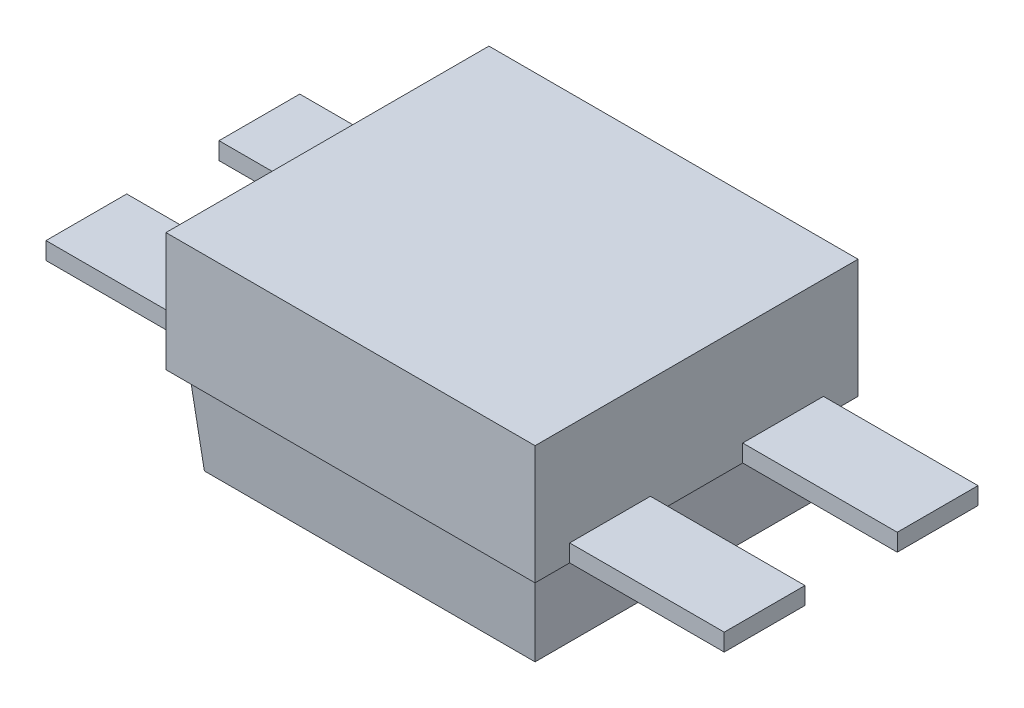
ISO-10303-21;
HEADER;
FILE_DESCRIPTION(('STEP AP214'),'2;1');
FILE_NAME('part.step','',(''),(''),'','','');
FILE_SCHEMA(('AUTOMOTIVE_DESIGN { 1 0 10303 214 1 1 1 1 }'));
ENDSEC;
DATA;
#1=APPLICATION_CONTEXT('core data for automotive mechanical design processes');
#2=APPLICATION_PROTOCOL_DEFINITION('international standard','automotive_design',2000,#1);
#3=PRODUCT_CONTEXT('',#1,'mechanical');
#4=PRODUCT('Part','Part','',(#3));
#5=PRODUCT_RELATED_PRODUCT_CATEGORY('part','',(#4));
#6=PRODUCT_DEFINITION_FORMATION('','',#4);
#7=PRODUCT_DEFINITION_CONTEXT('part definition',#1,'design');
#8=PRODUCT_DEFINITION('design','',#6,#7);
#9=PRODUCT_DEFINITION_SHAPE('','',#8);
#10=(LENGTH_UNIT() NAMED_UNIT(*) SI_UNIT(.MILLI.,.METRE.));
#11=(NAMED_UNIT(*) PLANE_ANGLE_UNIT() SI_UNIT($,.RADIAN.));
#12=(NAMED_UNIT(*) SI_UNIT($,.STERADIAN.) SOLID_ANGLE_UNIT());
#13=UNCERTAINTY_MEASURE_WITH_UNIT(LENGTH_MEASURE(1.E-05),#10,'distance_accuracy_value','');
#14=(GEOMETRIC_REPRESENTATION_CONTEXT(3) GLOBAL_UNCERTAINTY_ASSIGNED_CONTEXT((#13)) GLOBAL_UNIT_ASSIGNED_CONTEXT((#10,
#11,#12)) REPRESENTATION_CONTEXT('',''));
#15=CARTESIAN_POINT('',(0.,0.,0.));
#16=DIRECTION('',(0.,0.,1.));
#17=DIRECTION('',(1.,0.,0.));
#18=AXIS2_PLACEMENT_3D('',#15,#16,#17);
#19=CARTESIAN_POINT('',(0.,-0.91,0.));
#20=DIRECTION('',(0.,1.,0.));
#21=DIRECTION('',(0.,0.,1.));
#22=AXIS2_PLACEMENT_3D('',#19,#20,#21);
#23=PLANE('',#22);
#24=DIRECTION('',(1.,0.,0.));
#25=VECTOR('',#24,1.);
#26=CARTESIAN_POINT('',(-1.5,-0.91,1.2335086157203));
#27=LINE('',#26,#25);
#28=CARTESIAN_POINT('',(-1.4335086157203,-0.91,1.2335086157203));
#29=VERTEX_POINT('',#28);
#30=CARTESIAN_POINT('',(1.4335086157203,-0.91,1.2335086157203));
#31=VERTEX_POINT('',#30);
#32=EDGE_CURVE('P0_E174',#29,#31,#27,.T.);
#33=ORIENTED_EDGE('',*,*,#32,.F.);
#34=DIRECTION('',(0.,0.,1.));
#35=VECTOR('',#34,1.);
#36=CARTESIAN_POINT('',(-1.4335086157203,-0.91,1.3));
#37=LINE('',#36,#35);
#38=CARTESIAN_POINT('',(-1.4335086157203,-0.91,-1.2335086157203));
#39=VERTEX_POINT('',#38);
#40=EDGE_CURVE('P0_E176',#39,#29,#37,.T.);
#41=ORIENTED_EDGE('',*,*,#40,.F.);
#42=DIRECTION('',(1.,0.,0.));
#43=VECTOR('',#42,1.);
#44=CARTESIAN_POINT('',(-1.5,-0.91,-1.2335086157203));
#45=LINE('',#44,#43);
#46=CARTESIAN_POINT('',(1.4335086157203,-0.91,-1.2335086157203));
#47=VERTEX_POINT('',#46);
#48=EDGE_CURVE('P0_E178',#47,#39,#45,.F.);
#49=ORIENTED_EDGE('',*,*,#48,.F.);
#50=DIRECTION('',(0.,0.,1.));
#51=VECTOR('',#50,1.);
#52=CARTESIAN_POINT('',(1.4335086157203,-0.91,1.3));
#53=LINE('',#52,#51);
#54=EDGE_CURVE('P0_E340',#31,#47,#53,.F.);
#55=ORIENTED_EDGE('',*,*,#54,.F.);
#56=EDGE_LOOP('',(#33,#41,#49,#55));
#57=FACE_BOUND('',#56,.T.);
#58=ADVANCED_FACE('P0_F16',(#57),#23,.F.);
#59=CARTESIAN_POINT('',(-2.94,-0.91,0.));
#60=DIRECTION('',(-1.,0.,0.));
#61=DIRECTION('',(0.,0.,1.));
#62=AXIS2_PLACEMENT_3D('',#59,#60,#61);
#63=PLANE('',#62);
#64=DIRECTION('',(0.,1.,0.));
#65=VECTOR('',#64,1.);
#66=CARTESIAN_POINT('',(-2.94,-0.91,-0.399999999999999));
#67=LINE('',#66,#65);
#68=CARTESIAN_POINT('',(-2.94,0.,-0.399999999999999));
#69=VERTEX_POINT('',#68);
#70=CARTESIAN_POINT('',(-2.94,-0.15,-0.399999999999999));
#71=VERTEX_POINT('',#70);
#72=EDGE_CURVE('P0_E203',#69,#71,#67,.F.);
#73=ORIENTED_EDGE('',*,*,#72,.F.);
#74=DIRECTION('',(0.,0.,1.));
#75=VECTOR('',#74,1.);
#76=CARTESIAN_POINT('',(-2.94,0.,0.));
#77=LINE('',#76,#75);
#78=CARTESIAN_POINT('',(-2.94,0.,-1.1));
#79=VERTEX_POINT('',#78);
#80=EDGE_CURVE('P0_E332',#79,#69,#77,.T.);
#81=ORIENTED_EDGE('',*,*,#80,.F.);
#82=DIRECTION('',(0.,1.,0.));
#83=VECTOR('',#82,1.);
#84=CARTESIAN_POINT('',(-2.94,-0.91,-1.1));
#85=LINE('',#84,#83);
#86=CARTESIAN_POINT('',(-2.94,-0.15,-1.1));
#87=VERTEX_POINT('',#86);
#88=EDGE_CURVE('P0_E229',#87,#79,#85,.T.);
#89=ORIENTED_EDGE('',*,*,#88,.F.);
#90=DIRECTION('',(0.,0.,-1.));
#91=VECTOR('',#90,1.);
#92=CARTESIAN_POINT('',(-2.94,-0.15,0.));
#93=LINE('',#92,#91);
#94=EDGE_CURVE('P0_E251',#71,#87,#93,.T.);
#95=ORIENTED_EDGE('',*,*,#94,.F.);
#96=EDGE_LOOP('',(#73,#81,#89,#95));
#97=FACE_BOUND('',#96,.T.);
#98=ADVANCED_FACE('P0_F488',(#97),#63,.T.);
#99=CARTESIAN_POINT('',(0.,-0.91,-1.1));
#100=DIRECTION('',(0.,0.,-1.));
#101=DIRECTION('',(-1.,0.,0.));
#102=AXIS2_PLACEMENT_3D('',#99,#100,#101);
#103=PLANE('',#102);
#104=ORIENTED_EDGE('',*,*,#88,.T.);
#105=DIRECTION('',(1.,0.,0.));
#106=VECTOR('',#105,1.);
#107=CARTESIAN_POINT('',(0.,0.,-1.1));
#108=LINE('',#107,#106);
#109=CARTESIAN_POINT('',(-1.6,0.,-1.1));
#110=VERTEX_POINT('',#109);
#111=EDGE_CURVE('P0_E239',#110,#79,#108,.F.);
#112=ORIENTED_EDGE('',*,*,#111,.F.);
#113=DIRECTION('',(0.,1.,0.));
#114=VECTOR('',#113,1.);
#115=CARTESIAN_POINT('',(-1.6,-0.91,-1.1));
#116=LINE('',#115,#114);
#117=CARTESIAN_POINT('',(-1.6,-0.15,-1.1));
#118=VERTEX_POINT('',#117);
#119=EDGE_CURVE('P0_E19',#110,#118,#116,.F.);
#120=ORIENTED_EDGE('',*,*,#119,.T.);
#121=DIRECTION('',(1.,0.,0.));
#122=VECTOR('',#121,1.);
#123=CARTESIAN_POINT('',(0.,-0.15,-1.1));
#124=LINE('',#123,#122);
#125=EDGE_CURVE('P0_E236',#87,#118,#124,.T.);
#126=ORIENTED_EDGE('',*,*,#125,.F.);
#127=EDGE_LOOP('',(#104,#112,#120,#126));
#128=FACE_BOUND('',#127,.T.);
#129=ADVANCED_FACE('P0_F235',(#128),#103,.T.);
#130=CARTESIAN_POINT('',(0.,-0.91,-1.1));
#131=DIRECTION('',(0.,0.,1.));
#132=DIRECTION('',(1.,0.,0.));
#133=AXIS2_PLACEMENT_3D('',#130,#131,#132);
#134=PLANE('',#133);
#135=DIRECTION('',(0.,1.,0.));
#136=VECTOR('',#135,1.);
#137=CARTESIAN_POINT('',(1.6,-0.91,-1.1));
#138=LINE('',#137,#136);
#139=CARTESIAN_POINT('',(1.6,0.,-1.1));
#140=VERTEX_POINT('',#139);
#141=CARTESIAN_POINT('',(1.6,-0.15,-1.1));
#142=VERTEX_POINT('',#141);
#143=EDGE_CURVE('P0_E228',#140,#142,#138,.F.);
#144=ORIENTED_EDGE('',*,*,#143,.F.);
#145=DIRECTION('',(1.,0.,0.));
#146=VECTOR('',#145,1.);
#147=CARTESIAN_POINT('',(0.,0.,-1.1));
#148=LINE('',#147,#146);
#149=CARTESIAN_POINT('',(2.94,0.,-1.1));
#150=VERTEX_POINT('',#149);
#151=EDGE_CURVE('P0_E308',#150,#140,#148,.F.);
#152=ORIENTED_EDGE('',*,*,#151,.F.);
#153=DIRECTION('',(0.,1.,0.));
#154=VECTOR('',#153,1.);
#155=CARTESIAN_POINT('',(2.94,-0.91,-1.1));
#156=LINE('',#155,#154);
#157=CARTESIAN_POINT('',(2.94,-0.15,-1.1));
#158=VERTEX_POINT('',#157);
#159=EDGE_CURVE('P0_E226',#150,#158,#156,.F.);
#160=ORIENTED_EDGE('',*,*,#159,.T.);
#161=DIRECTION('',(1.,0.,0.));
#162=VECTOR('',#161,1.);
#163=CARTESIAN_POINT('',(0.,-0.15,-1.1));
#164=LINE('',#163,#162);
#165=EDGE_CURVE('P0_E252',#142,#158,#164,.T.);
#166=ORIENTED_EDGE('',*,*,#165,.F.);
#167=EDGE_LOOP('',(#144,#152,#160,#166));
#168=FACE_BOUND('',#167,.T.);
#169=ADVANCED_FACE('P0_F471',(#168),#134,.F.);
#170=CARTESIAN_POINT('',(2.94,-0.91,0.));
#171=DIRECTION('',(-1.,0.,0.));
#172=DIRECTION('',(0.,0.,1.));
#173=AXIS2_PLACEMENT_3D('',#170,#171,#172);
#174=PLANE('',#173);
#175=ORIENTED_EDGE('',*,*,#159,.F.);
#176=DIRECTION('',(0.,0.,1.));
#177=VECTOR('',#176,1.);
#178=CARTESIAN_POINT('',(2.94,0.,0.));
#179=LINE('',#178,#177);
#180=CARTESIAN_POINT('',(2.94,0.,-0.4));
#181=VERTEX_POINT('',#180);
#182=EDGE_CURVE('P0_E302',#181,#150,#179,.F.);
#183=ORIENTED_EDGE('',*,*,#182,.F.);
#184=DIRECTION('',(0.,1.,0.));
#185=VECTOR('',#184,1.);
#186=CARTESIAN_POINT('',(2.94,-0.91,-0.4));
#187=LINE('',#186,#185);
#188=CARTESIAN_POINT('',(2.94,-0.15,-0.4));
#189=VERTEX_POINT('',#188);
#190=EDGE_CURVE('P0_E222',#181,#189,#187,.F.);
#191=ORIENTED_EDGE('',*,*,#190,.T.);
#192=DIRECTION('',(0.,0.,-1.));
#193=VECTOR('',#192,1.);
#194=CARTESIAN_POINT('',(2.94,-0.15,0.));
#195=LINE('',#194,#193);
#196=EDGE_CURVE('P0_E296',#158,#189,#195,.F.);
#197=ORIENTED_EDGE('',*,*,#196,.F.);
#198=EDGE_LOOP('',(#175,#183,#191,#197));
#199=FACE_BOUND('',#198,.T.);
#200=ADVANCED_FACE('P0_F475',(#199),#174,.F.);
#201=CARTESIAN_POINT('',(0.,-0.91,-0.4));
#202=DIRECTION('',(0.,0.,-1.));
#203=DIRECTION('',(-1.,0.,0.));
#204=AXIS2_PLACEMENT_3D('',#201,#202,#203);
#205=PLANE('',#204);
#206=ORIENTED_EDGE('',*,*,#190,.F.);
#207=DIRECTION('',(1.,0.,0.));
#208=VECTOR('',#207,1.);
#209=CARTESIAN_POINT('',(0.,0.,-0.4));
#210=LINE('',#209,#208);
#211=CARTESIAN_POINT('',(1.6,0.,-0.4));
#212=VERTEX_POINT('',#211);
#213=EDGE_CURVE('P0_E305',#212,#181,#210,.T.);
#214=ORIENTED_EDGE('',*,*,#213,.F.);
#215=DIRECTION('',(0.,1.,0.));
#216=VECTOR('',#215,1.);
#217=CARTESIAN_POINT('',(1.6,-0.91,-0.4));
#218=LINE('',#217,#216);
#219=CARTESIAN_POINT('',(1.6,-0.15,-0.4));
#220=VERTEX_POINT('',#219);
#221=EDGE_CURVE('P0_E224',#220,#212,#218,.T.);
#222=ORIENTED_EDGE('',*,*,#221,.F.);
#223=DIRECTION('',(1.,0.,0.));
#224=VECTOR('',#223,1.);
#225=CARTESIAN_POINT('',(0.,-0.15,-0.4));
#226=LINE('',#225,#224);
#227=EDGE_CURVE('P0_E293',#189,#220,#226,.F.);
#228=ORIENTED_EDGE('',*,*,#227,.F.);
#229=EDGE_LOOP('',(#206,#214,#222,#228));
#230=FACE_BOUND('',#229,.T.);
#231=ADVANCED_FACE('P0_F467',(#230),#205,.F.);
#232=CARTESIAN_POINT('',(0.,-0.91,0.4));
#233=DIRECTION('',(0.,0.,1.));
#234=DIRECTION('',(1.,0.,0.));
#235=AXIS2_PLACEMENT_3D('',#232,#233,#234);
#236=PLANE('',#235);
#237=DIRECTION('',(0.,1.,0.));
#238=VECTOR('',#237,1.);
#239=CARTESIAN_POINT('',(1.6,-0.91,0.4));
#240=LINE('',#239,#238);
#241=CARTESIAN_POINT('',(1.6,0.,0.4));
#242=VERTEX_POINT('',#241);
#243=CARTESIAN_POINT('',(1.6,-0.15,0.4));
#244=VERTEX_POINT('',#243);
#245=EDGE_CURVE('P0_E220',#242,#244,#240,.F.);
#246=ORIENTED_EDGE('',*,*,#245,.F.);
#247=DIRECTION('',(1.,0.,0.));
#248=VECTOR('',#247,1.);
#249=CARTESIAN_POINT('',(0.,0.,0.4));
#250=LINE('',#249,#248);
#251=CARTESIAN_POINT('',(2.94,0.,0.4));
#252=VERTEX_POINT('',#251);
#253=EDGE_CURVE('P0_E317',#252,#242,#250,.F.);
#254=ORIENTED_EDGE('',*,*,#253,.F.);
#255=DIRECTION('',(0.,1.,0.));
#256=VECTOR('',#255,1.);
#257=CARTESIAN_POINT('',(2.94,-0.91,0.4));
#258=LINE('',#257,#256);
#259=CARTESIAN_POINT('',(2.94,-0.15,0.4));
#260=VERTEX_POINT('',#259);
#261=EDGE_CURVE('P0_E218',#252,#260,#258,.F.);
#262=ORIENTED_EDGE('',*,*,#261,.T.);
#263=DIRECTION('',(1.,0.,0.));
#264=VECTOR('',#263,1.);
#265=CARTESIAN_POINT('',(0.,-0.15,0.4));
#266=LINE('',#265,#264);
#267=EDGE_CURVE('P0_E290',#244,#260,#266,.T.);
#268=ORIENTED_EDGE('',*,*,#267,.F.);
#269=EDGE_LOOP('',(#246,#254,#262,#268));
#270=FACE_BOUND('',#269,.T.);
#271=ADVANCED_FACE('P0_F459',(#270),#236,.F.);
#272=CARTESIAN_POINT('',(2.94,-0.91,0.));
#273=DIRECTION('',(-1.,0.,0.));
#274=DIRECTION('',(0.,0.,1.));
#275=AXIS2_PLACEMENT_3D('',#272,#273,#274);
#276=PLANE('',#275);
#277=ORIENTED_EDGE('',*,*,#261,.F.);
#278=DIRECTION('',(0.,0.,1.));
#279=VECTOR('',#278,1.);
#280=CARTESIAN_POINT('',(2.94,0.,0.));
#281=LINE('',#280,#279);
#282=CARTESIAN_POINT('',(2.94,0.,1.1));
#283=VERTEX_POINT('',#282);
#284=EDGE_CURVE('P0_E311',#283,#252,#281,.F.);
#285=ORIENTED_EDGE('',*,*,#284,.F.);
#286=DIRECTION('',(0.,1.,0.));
#287=VECTOR('',#286,1.);
#288=CARTESIAN_POINT('',(2.94,-0.91,1.1));
#289=LINE('',#288,#287);
#290=CARTESIAN_POINT('',(2.94,-0.15,1.1));
#291=VERTEX_POINT('',#290);
#292=EDGE_CURVE('P0_E214',#283,#291,#289,.F.);
#293=ORIENTED_EDGE('',*,*,#292,.T.);
#294=DIRECTION('',(0.,0.,-1.));
#295=VECTOR('',#294,1.);
#296=CARTESIAN_POINT('',(2.94,-0.15,0.));
#297=LINE('',#296,#295);
#298=EDGE_CURVE('P0_E287',#260,#291,#297,.F.);
#299=ORIENTED_EDGE('',*,*,#298,.F.);
#300=EDGE_LOOP('',(#277,#285,#293,#299));
#301=FACE_BOUND('',#300,.T.);
#302=ADVANCED_FACE('P0_F461',(#301),#276,.F.);
#303=CARTESIAN_POINT('',(0.,-0.91,1.1));
#304=DIRECTION('',(0.,0.,-1.));
#305=DIRECTION('',(-1.,0.,0.));
#306=AXIS2_PLACEMENT_3D('',#303,#304,#305);
#307=PLANE('',#306);
#308=ORIENTED_EDGE('',*,*,#292,.F.);
#309=DIRECTION('',(1.,0.,0.));
#310=VECTOR('',#309,1.);
#311=CARTESIAN_POINT('',(0.,0.,1.1));
#312=LINE('',#311,#310);
#313=CARTESIAN_POINT('',(1.6,0.,1.1));
#314=VERTEX_POINT('',#313);
#315=EDGE_CURVE('P0_E314',#314,#283,#312,.T.);
#316=ORIENTED_EDGE('',*,*,#315,.F.);
#317=DIRECTION('',(0.,1.,0.));
#318=VECTOR('',#317,1.);
#319=CARTESIAN_POINT('',(1.6,-0.91,1.1));
#320=LINE('',#319,#318);
#321=CARTESIAN_POINT('',(1.6,-0.15,1.1));
#322=VERTEX_POINT('',#321);
#323=EDGE_CURVE('P0_E216',#322,#314,#320,.T.);
#324=ORIENTED_EDGE('',*,*,#323,.F.);
#325=DIRECTION('',(1.,0.,0.));
#326=VECTOR('',#325,1.);
#327=CARTESIAN_POINT('',(0.,-0.15,1.1));
#328=LINE('',#327,#326);
#329=EDGE_CURVE('P0_E284',#291,#322,#328,.F.);
#330=ORIENTED_EDGE('',*,*,#329,.F.);
#331=EDGE_LOOP('',(#308,#316,#324,#330));
#332=FACE_BOUND('',#331,.T.);
#333=ADVANCED_FACE('P0_F452',(#332),#307,.F.);
#334=CARTESIAN_POINT('',(0.,-0.91,1.1));
#335=DIRECTION('',(0.,0.,1.));
#336=DIRECTION('',(1.,0.,0.));
#337=AXIS2_PLACEMENT_3D('',#334,#335,#336);
#338=PLANE('',#337);
#339=DIRECTION('',(0.,1.,0.));
#340=VECTOR('',#339,1.);
#341=CARTESIAN_POINT('',(-1.6,-0.91,1.1));
#342=LINE('',#341,#340);
#343=CARTESIAN_POINT('',(-1.6,-0.15,1.1));
#344=VERTEX_POINT('',#343);
#345=CARTESIAN_POINT('',(-1.6,0.,1.1));
#346=VERTEX_POINT('',#345);
#347=EDGE_CURVE('P0_E212',#344,#346,#342,.T.);
#348=ORIENTED_EDGE('',*,*,#347,.T.);
#349=DIRECTION('',(1.,0.,0.));
#350=VECTOR('',#349,1.);
#351=CARTESIAN_POINT('',(0.,0.,1.1));
#352=LINE('',#351,#350);
#353=CARTESIAN_POINT('',(-2.94,0.,1.1));
#354=VERTEX_POINT('',#353);
#355=EDGE_CURVE('P0_E320',#354,#346,#352,.T.);
#356=ORIENTED_EDGE('',*,*,#355,.F.);
#357=DIRECTION('',(0.,1.,0.));
#358=VECTOR('',#357,1.);
#359=CARTESIAN_POINT('',(-2.94,-0.91,1.1));
#360=LINE('',#359,#358);
#361=CARTESIAN_POINT('',(-2.94,-0.15,1.1));
#362=VERTEX_POINT('',#361);
#363=EDGE_CURVE('P0_E210',#362,#354,#360,.T.);
#364=ORIENTED_EDGE('',*,*,#363,.F.);
#365=DIRECTION('',(1.,0.,0.));
#366=VECTOR('',#365,1.);
#367=CARTESIAN_POINT('',(0.,-0.15,1.1));
#368=LINE('',#367,#366);
#369=EDGE_CURVE('P0_E281',#344,#362,#368,.F.);
#370=ORIENTED_EDGE('',*,*,#369,.F.);
#371=EDGE_LOOP('',(#348,#356,#364,#370));
#372=FACE_BOUND('',#371,.T.);
#373=ADVANCED_FACE('P0_F406',(#372),#338,.T.);
#374=CARTESIAN_POINT('',(-2.94,-0.91,0.));
#375=DIRECTION('',(-1.,0.,0.));
#376=DIRECTION('',(0.,0.,1.));
#377=AXIS2_PLACEMENT_3D('',#374,#375,#376);
#378=PLANE('',#377);
#379=ORIENTED_EDGE('',*,*,#363,.T.);
#380=DIRECTION('',(0.,0.,1.));
#381=VECTOR('',#380,1.);
#382=CARTESIAN_POINT('',(-2.94,0.,0.));
#383=LINE('',#382,#381);
#384=CARTESIAN_POINT('',(-2.94,0.,0.400000000000001));
#385=VERTEX_POINT('',#384);
#386=EDGE_CURVE('P0_E323',#385,#354,#383,.T.);
#387=ORIENTED_EDGE('',*,*,#386,.F.);
#388=DIRECTION('',(0.,1.,0.));
#389=VECTOR('',#388,1.);
#390=CARTESIAN_POINT('',(-2.94,-0.91,0.400000000000001));
#391=LINE('',#390,#389);
#392=CARTESIAN_POINT('',(-2.94,-0.15,0.400000000000001));
#393=VERTEX_POINT('',#392);
#394=EDGE_CURVE('P0_E206',#393,#385,#391,.T.);
#395=ORIENTED_EDGE('',*,*,#394,.F.);
#396=DIRECTION('',(0.,0.,-1.));
#397=VECTOR('',#396,1.);
#398=CARTESIAN_POINT('',(-2.94,-0.15,0.));
#399=LINE('',#398,#397);
#400=EDGE_CURVE('P0_E278',#362,#393,#399,.T.);
#401=ORIENTED_EDGE('',*,*,#400,.F.);
#402=EDGE_LOOP('',(#379,#387,#395,#401));
#403=FACE_BOUND('',#402,.T.);
#404=ADVANCED_FACE('P0_F401',(#403),#378,.T.);
#405=CARTESIAN_POINT('',(0.,-0.91,0.4));
#406=DIRECTION('',(0.,0.,-1.));
#407=DIRECTION('',(-1.,0.,0.));
#408=AXIS2_PLACEMENT_3D('',#405,#406,#407);
#409=PLANE('',#408);
#410=ORIENTED_EDGE('',*,*,#394,.T.);
#411=DIRECTION('',(1.,0.,0.));
#412=VECTOR('',#411,1.);
#413=CARTESIAN_POINT('',(0.,0.,0.4));
#414=LINE('',#413,#412);
#415=CARTESIAN_POINT('',(-1.6,0.,0.4));
#416=VERTEX_POINT('',#415);
#417=EDGE_CURVE('P0_E326',#416,#385,#414,.F.);
#418=ORIENTED_EDGE('',*,*,#417,.F.);
#419=DIRECTION('',(0.,1.,0.));
#420=VECTOR('',#419,1.);
#421=CARTESIAN_POINT('',(-1.6,-0.91,0.4));
#422=LINE('',#421,#420);
#423=CARTESIAN_POINT('',(-1.6,-0.15,0.4));
#424=VERTEX_POINT('',#423);
#425=EDGE_CURVE('P0_E208',#416,#424,#422,.F.);
#426=ORIENTED_EDGE('',*,*,#425,.T.);
#427=DIRECTION('',(1.,0.,0.));
#428=VECTOR('',#427,1.);
#429=CARTESIAN_POINT('',(0.,-0.15,0.400000000000001));
#430=LINE('',#429,#428);
#431=EDGE_CURVE('P0_E275',#393,#424,#430,.T.);
#432=ORIENTED_EDGE('',*,*,#431,.F.);
#433=EDGE_LOOP('',(#410,#418,#426,#432));
#434=FACE_BOUND('',#433,.T.);
#435=ADVANCED_FACE('P0_F499',(#434),#409,.T.);
#436=CARTESIAN_POINT('',(0.,-0.91,-0.4));
#437=DIRECTION('',(0.,0.,1.));
#438=DIRECTION('',(1.,0.,0.));
#439=AXIS2_PLACEMENT_3D('',#436,#437,#438);
#440=PLANE('',#439);
#441=DIRECTION('',(0.,1.,0.));
#442=VECTOR('',#441,1.);
#443=CARTESIAN_POINT('',(-1.6,-0.91,-0.399999999999999));
#444=LINE('',#443,#442);
#445=CARTESIAN_POINT('',(-1.6,-0.15,-0.399999999999999));
#446=VERTEX_POINT('',#445);
#447=CARTESIAN_POINT('',(-1.6,0.,-0.399999999999999));
#448=VERTEX_POINT('',#447);
#449=EDGE_CURVE('P0_E191',#446,#448,#444,.T.);
#450=ORIENTED_EDGE('',*,*,#449,.T.);
#451=DIRECTION('',(1.,0.,0.));
#452=VECTOR('',#451,1.);
#453=CARTESIAN_POINT('',(0.,0.,-0.399999999999999));
#454=LINE('',#453,#452);
#455=EDGE_CURVE('P0_E329',#69,#448,#454,.T.);
#456=ORIENTED_EDGE('',*,*,#455,.F.);
#457=ORIENTED_EDGE('',*,*,#72,.T.);
#458=DIRECTION('',(1.,0.,0.));
#459=VECTOR('',#458,1.);
#460=CARTESIAN_POINT('',(0.,-0.15,-0.399999999999999));
#461=LINE('',#460,#459);
#462=EDGE_CURVE('P0_E273',#446,#71,#461,.F.);
#463=ORIENTED_EDGE('',*,*,#462,.F.);
#464=EDGE_LOOP('',(#450,#456,#457,#463));
#465=FACE_BOUND('',#464,.T.);
#466=ADVANCED_FACE('P0_F497',(#465),#440,.T.);
#467=CARTESIAN_POINT('',(-1.5,-0.15,-1.3));
#468=DIRECTION('',(0.,-0.0871557427476584,-0.996194698091746));
#469=DIRECTION('',(0.,0.996194698091746,-0.0871557427476584));
#470=AXIS2_PLACEMENT_3D('',#467,#468,#469);
#471=PLANE('',#470);
#472=DIRECTION('',(1.,0.,0.));
#473=VECTOR('',#472,1.);
#474=CARTESIAN_POINT('',(0.,-0.15,-1.3));
#475=LINE('',#474,#473);
#476=CARTESIAN_POINT('',(1.5,-0.15,-1.3));
#477=VERTEX_POINT('',#476);
#478=CARTESIAN_POINT('',(-1.5,-0.15,-1.3));
#479=VERTEX_POINT('',#478);
#480=EDGE_CURVE('P0_E271',#477,#479,#475,.F.);
#481=ORIENTED_EDGE('',*,*,#480,.F.);
#482=DIRECTION('',(0.0868265938642477,0.992432509138967,-0.0868265938642483));
#483=VECTOR('',#482,1.);
#484=CARTESIAN_POINT('',(1.4335086157203,-0.91,-1.2335086157203));
#485=LINE('',#484,#483);
#486=EDGE_CURVE('P0_E189',#47,#477,#485,.T.);
#487=ORIENTED_EDGE('',*,*,#486,.F.);
#488=ORIENTED_EDGE('',*,*,#48,.T.);
#489=DIRECTION('',(0.0868265938642477,-0.992432509138967,0.0868265938642483));
#490=VECTOR('',#489,1.);
#491=CARTESIAN_POINT('',(-1.5,-0.15,-1.3));
#492=LINE('',#491,#490);
#493=EDGE_CURVE('P0_E183',#479,#39,#492,.T.);
#494=ORIENTED_EDGE('',*,*,#493,.F.);
#495=EDGE_LOOP('',(#481,#487,#488,#494));
#496=FACE_BOUND('',#495,.T.);
#497=ADVANCED_FACE('P0_F186',(#496),#471,.T.);
#498=CARTESIAN_POINT('',(-1.5,-0.15,1.3));
#499=DIRECTION('',(-0.996194698091746,-0.0871557427476584,0.));
#500=DIRECTION('',(0.0871557427476584,-0.996194698091746,0.));
#501=AXIS2_PLACEMENT_3D('',#498,#499,#500);
#502=PLANE('',#501);
#503=DIRECTION('',(0.,0.,-1.));
#504=VECTOR('',#503,1.);
#505=CARTESIAN_POINT('',(-1.5,-0.15,0.));
#506=LINE('',#505,#504);
#507=CARTESIAN_POINT('',(-1.5,-0.15,1.3));
#508=VERTEX_POINT('',#507);
#509=EDGE_CURVE('P0_E195',#479,#508,#506,.F.);
#510=ORIENTED_EDGE('',*,*,#509,.F.);
#511=ORIENTED_EDGE('',*,*,#493,.T.);
#512=ORIENTED_EDGE('',*,*,#40,.T.);
#513=DIRECTION('',(0.0868265938642478,-0.992432509138967,-0.0868265938642478));
#514=VECTOR('',#513,1.);
#515=CARTESIAN_POINT('',(-1.5,-0.15,1.3));
#516=LINE('',#515,#514);
#517=EDGE_CURVE('P0_E198',#508,#29,#516,.T.);
#518=ORIENTED_EDGE('',*,*,#517,.F.);
#519=EDGE_LOOP('',(#510,#511,#512,#518));
#520=FACE_BOUND('',#519,.T.);
#521=ADVANCED_FACE('P0_F193',(#520),#502,.T.);
#522=CARTESIAN_POINT('',(-1.5,-0.15,1.3));
#523=DIRECTION('',(0.,-0.0871557427476584,0.996194698091746));
#524=DIRECTION('',(0.,-0.996194698091746,-0.0871557427476584));
#525=AXIS2_PLACEMENT_3D('',#522,#523,#524);
#526=PLANE('',#525);
#527=DIRECTION('',(1.,0.,0.));
#528=VECTOR('',#527,1.);
#529=CARTESIAN_POINT('',(0.,-0.15,1.3));
#530=LINE('',#529,#528);
#531=CARTESIAN_POINT('',(1.5,-0.15,1.3));
#532=VERTEX_POINT('',#531);
#533=EDGE_CURVE('P0_E264',#508,#532,#530,.T.);
#534=ORIENTED_EDGE('',*,*,#533,.F.);
#535=ORIENTED_EDGE('',*,*,#517,.T.);
#536=ORIENTED_EDGE('',*,*,#32,.T.);
#537=DIRECTION('',(-0.0868265938642478,-0.992432509138967,-0.086826593864248));
#538=VECTOR('',#537,1.);
#539=CARTESIAN_POINT('',(1.5,-0.15,1.3));
#540=LINE('',#539,#538);
#541=EDGE_CURVE('P0_E336',#532,#31,#540,.T.);
#542=ORIENTED_EDGE('',*,*,#541,.F.);
#543=EDGE_LOOP('',(#534,#535,#536,#542));
#544=FACE_BOUND('',#543,.T.);
#545=ADVANCED_FACE('P0_F343',(#544),#526,.T.);
#546=CARTESIAN_POINT('',(1.5,-0.15,1.3));
#547=DIRECTION('',(0.996194698091746,-0.0871557427476584,0.));
#548=DIRECTION('',(0.0871557427476584,0.996194698091746,0.));
#549=AXIS2_PLACEMENT_3D('',#546,#547,#548);
#550=PLANE('',#549);
#551=DIRECTION('',(0.,0.,-1.));
#552=VECTOR('',#551,1.);
#553=CARTESIAN_POINT('',(1.5,-0.15,0.));
#554=LINE('',#553,#552);
#555=EDGE_CURVE('P0_E259',#532,#477,#554,.T.);
#556=ORIENTED_EDGE('',*,*,#555,.F.);
#557=ORIENTED_EDGE('',*,*,#541,.T.);
#558=ORIENTED_EDGE('',*,*,#54,.T.);
#559=ORIENTED_EDGE('',*,*,#486,.T.);
#560=EDGE_LOOP('',(#556,#557,#558,#559));
#561=FACE_BOUND('',#560,.T.);
#562=ADVANCED_FACE('P0_F347',(#561),#550,.T.);
#563=CARTESIAN_POINT('',(0.,0.,0.));
#564=DIRECTION('',(0.,1.,0.));
#565=DIRECTION('',(0.,0.,1.));
#566=AXIS2_PLACEMENT_3D('',#563,#564,#565);
#567=PLANE('',#566);
#568=ORIENTED_EDGE('',*,*,#80,.T.);
#569=ORIENTED_EDGE('',*,*,#455,.T.);
#570=DIRECTION('',(0.,0.,1.));
#571=VECTOR('',#570,1.);
#572=CARTESIAN_POINT('',(-1.6,0.,0.));
#573=LINE('',#572,#571);
#574=EDGE_CURVE('P0_E258',#110,#448,#573,.T.);
#575=ORIENTED_EDGE('',*,*,#574,.F.);
#576=ORIENTED_EDGE('',*,*,#111,.T.);
#577=EDGE_LOOP('',(#568,#569,#575,#576));
#578=FACE_BOUND('',#577,.T.);
#579=ADVANCED_FACE('P0_F349',(#578),#567,.T.);
#580=CARTESIAN_POINT('',(0.,0.,0.));
#581=DIRECTION('',(0.,1.,0.));
#582=DIRECTION('',(0.,0.,1.));
#583=AXIS2_PLACEMENT_3D('',#580,#581,#582);
#584=PLANE('',#583);
#585=ORIENTED_EDGE('',*,*,#386,.T.);
#586=ORIENTED_EDGE('',*,*,#355,.T.);
#587=DIRECTION('',(0.,0.,1.));
#588=VECTOR('',#587,1.);
#589=CARTESIAN_POINT('',(-1.6,0.,0.));
#590=LINE('',#589,#588);
#591=EDGE_CURVE('P0_E410',#416,#346,#590,.T.);
#592=ORIENTED_EDGE('',*,*,#591,.F.);
#593=ORIENTED_EDGE('',*,*,#417,.T.);
#594=EDGE_LOOP('',(#585,#586,#592,#593));
#595=FACE_BOUND('',#594,.T.);
#596=ADVANCED_FACE('P0_F356',(#595),#584,.T.);
#597=CARTESIAN_POINT('',(0.,0.,0.));
#598=DIRECTION('',(0.,1.,0.));
#599=DIRECTION('',(0.,0.,1.));
#600=AXIS2_PLACEMENT_3D('',#597,#598,#599);
#601=PLANE('',#600);
#602=ORIENTED_EDGE('',*,*,#315,.T.);
#603=ORIENTED_EDGE('',*,*,#284,.T.);
#604=ORIENTED_EDGE('',*,*,#253,.T.);
#605=DIRECTION('',(0.,0.,-1.));
#606=VECTOR('',#605,1.);
#607=CARTESIAN_POINT('',(1.6,0.,0.));
#608=LINE('',#607,#606);
#609=EDGE_CURVE('P0_E425',#314,#242,#608,.T.);
#610=ORIENTED_EDGE('',*,*,#609,.F.);
#611=EDGE_LOOP('',(#602,#603,#604,#610));
#612=FACE_BOUND('',#611,.T.);
#613=ADVANCED_FACE('P0_F386',(#612),#601,.T.);
#614=CARTESIAN_POINT('',(0.,0.,0.));
#615=DIRECTION('',(0.,1.,0.));
#616=DIRECTION('',(0.,0.,1.));
#617=AXIS2_PLACEMENT_3D('',#614,#615,#616);
#618=PLANE('',#617);
#619=ORIENTED_EDGE('',*,*,#213,.T.);
#620=ORIENTED_EDGE('',*,*,#182,.T.);
#621=ORIENTED_EDGE('',*,*,#151,.T.);
#622=DIRECTION('',(0.,0.,-1.));
#623=VECTOR('',#622,1.);
#624=CARTESIAN_POINT('',(1.6,0.,0.));
#625=LINE('',#624,#623);
#626=EDGE_CURVE('P0_E431',#212,#140,#625,.T.);
#627=ORIENTED_EDGE('',*,*,#626,.F.);
#628=EDGE_LOOP('',(#619,#620,#621,#627));
#629=FACE_BOUND('',#628,.T.);
#630=ADVANCED_FACE('P0_F383',(#629),#618,.T.);
#631=CARTESIAN_POINT('',(0.,-0.15,0.));
#632=DIRECTION('',(0.,-1.,0.));
#633=DIRECTION('',(0.,0.,-1.));
#634=AXIS2_PLACEMENT_3D('',#631,#632,#633);
#635=PLANE('',#634);
#636=ORIENTED_EDGE('',*,*,#533,.T.);
#637=ORIENTED_EDGE('',*,*,#555,.T.);
#638=ORIENTED_EDGE('',*,*,#480,.T.);
#639=ORIENTED_EDGE('',*,*,#509,.T.);
#640=EDGE_LOOP('',(#636,#637,#638,#639));
#641=FACE_BOUND('',#640,.T.);
#642=DIRECTION('',(0.,0.,1.));
#643=VECTOR('',#642,1.);
#644=CARTESIAN_POINT('',(-1.6,-0.15,0.));
#645=LINE('',#644,#643);
#646=EDGE_CURVE('P0_E261',#446,#424,#645,.T.);
#647=ORIENTED_EDGE('',*,*,#646,.F.);
#648=ORIENTED_EDGE('',*,*,#462,.T.);
#649=ORIENTED_EDGE('',*,*,#94,.T.);
#650=ORIENTED_EDGE('',*,*,#125,.T.);
#651=DIRECTION('',(0.,0.,1.));
#652=VECTOR('',#651,1.);
#653=CARTESIAN_POINT('',(-1.6,-0.15,0.));
#654=LINE('',#653,#652);
#655=CARTESIAN_POINT('',(-1.6,-0.15,-1.4));
#656=VERTEX_POINT('',#655);
#657=EDGE_CURVE('P0_E248',#656,#118,#654,.T.);
#658=ORIENTED_EDGE('',*,*,#657,.F.);
#659=DIRECTION('',(-1.,0.,0.));
#660=VECTOR('',#659,1.);
#661=CARTESIAN_POINT('',(0.,-0.15,-1.4));
#662=LINE('',#661,#660);
#663=CARTESIAN_POINT('',(1.6,-0.15,-1.4));
#664=VERTEX_POINT('',#663);
#665=EDGE_CURVE('P0_E437',#664,#656,#662,.T.);
#666=ORIENTED_EDGE('',*,*,#665,.F.);
#667=DIRECTION('',(0.,0.,-1.));
#668=VECTOR('',#667,1.);
#669=CARTESIAN_POINT('',(1.6,-0.15,0.));
#670=LINE('',#669,#668);
#671=EDGE_CURVE('P0_E434',#142,#664,#670,.T.);
#672=ORIENTED_EDGE('',*,*,#671,.F.);
#673=ORIENTED_EDGE('',*,*,#165,.T.);
#674=ORIENTED_EDGE('',*,*,#196,.T.);
#675=ORIENTED_EDGE('',*,*,#227,.T.);
#676=DIRECTION('',(0.,0.,-1.));
#677=VECTOR('',#676,1.);
#678=CARTESIAN_POINT('',(1.6,-0.15,0.));
#679=LINE('',#678,#677);
#680=EDGE_CURVE('P0_E428',#244,#220,#679,.T.);
#681=ORIENTED_EDGE('',*,*,#680,.F.);
#682=ORIENTED_EDGE('',*,*,#267,.T.);
#683=ORIENTED_EDGE('',*,*,#298,.T.);
#684=ORIENTED_EDGE('',*,*,#329,.T.);
#685=DIRECTION('',(0.,0.,-1.));
#686=VECTOR('',#685,1.);
#687=CARTESIAN_POINT('',(1.6,-0.15,0.));
#688=LINE('',#687,#686);
#689=CARTESIAN_POINT('',(1.6,-0.15,1.4));
#690=VERTEX_POINT('',#689);
#691=EDGE_CURVE('P0_E422',#690,#322,#688,.T.);
#692=ORIENTED_EDGE('',*,*,#691,.F.);
#693=DIRECTION('',(-1.,0.,0.));
#694=VECTOR('',#693,1.);
#695=CARTESIAN_POINT('',(0.,-0.15,1.4));
#696=LINE('',#695,#694);
#697=CARTESIAN_POINT('',(-1.6,-0.15,1.4));
#698=VERTEX_POINT('',#697);
#699=EDGE_CURVE('P0_E417',#690,#698,#696,.T.);
#700=ORIENTED_EDGE('',*,*,#699,.T.);
#701=DIRECTION('',(0.,0.,1.));
#702=VECTOR('',#701,1.);
#703=CARTESIAN_POINT('',(-1.6,-0.15,0.));
#704=LINE('',#703,#702);
#705=EDGE_CURVE('P0_E408',#344,#698,#704,.T.);
#706=ORIENTED_EDGE('',*,*,#705,.F.);
#707=ORIENTED_EDGE('',*,*,#369,.T.);
#708=ORIENTED_EDGE('',*,*,#400,.T.);
#709=ORIENTED_EDGE('',*,*,#431,.T.);
#710=EDGE_LOOP('',(#647,#648,#649,#650,#658,#666,#672,#673,#674,#675,#681,#682,#683,#684,#692,
#700,#706,#707,#708,#709));
#711=FACE_BOUND('',#710,.T.);
#712=ADVANCED_FACE('P0_F246',(#641,#711),#635,.T.);
#713=CARTESIAN_POINT('',(-1.6,-0.91,0.));
#714=DIRECTION('',(-1.,0.,0.));
#715=DIRECTION('',(0.,0.,1.));
#716=AXIS2_PLACEMENT_3D('',#713,#714,#715);
#717=PLANE('',#716);
#718=DIRECTION('',(0.,1.,0.));
#719=VECTOR('',#718,1.);
#720=CARTESIAN_POINT('',(-1.6,-0.91,1.4));
#721=LINE('',#720,#719);
#722=CARTESIAN_POINT('',(-1.6,0.88,1.4));
#723=VERTEX_POINT('',#722);
#724=EDGE_CURVE('P0_E413',#698,#723,#721,.T.);
#725=ORIENTED_EDGE('',*,*,#724,.T.);
#726=DIRECTION('',(0.,0.,1.));
#727=VECTOR('',#726,1.);
#728=CARTESIAN_POINT('',(-1.6,0.88,0.));
#729=LINE('',#728,#727);
#730=CARTESIAN_POINT('',(-1.6,0.88,-1.4));
#731=VERTEX_POINT('',#730);
#732=EDGE_CURVE('P0_E440',#731,#723,#729,.T.);
#733=ORIENTED_EDGE('',*,*,#732,.F.);
#734=DIRECTION('',(0.,1.,0.));
#735=VECTOR('',#734,1.);
#736=CARTESIAN_POINT('',(-1.6,-0.91,-1.4));
#737=LINE('',#736,#735);
#738=EDGE_CURVE('P0_E256',#656,#731,#737,.T.);
#739=ORIENTED_EDGE('',*,*,#738,.F.);
#740=ORIENTED_EDGE('',*,*,#657,.T.);
#741=ORIENTED_EDGE('',*,*,#119,.F.);
#742=ORIENTED_EDGE('',*,*,#574,.T.);
#743=ORIENTED_EDGE('',*,*,#449,.F.);
#744=ORIENTED_EDGE('',*,*,#646,.T.);
#745=ORIENTED_EDGE('',*,*,#425,.F.);
#746=ORIENTED_EDGE('',*,*,#591,.T.);
#747=ORIENTED_EDGE('',*,*,#347,.F.);
#748=ORIENTED_EDGE('',*,*,#705,.T.);
#749=EDGE_LOOP('',(#725,#733,#739,#740,#741,#742,#743,#744,#745,#746,#747,#748));
#750=FACE_BOUND('',#749,.T.);
#751=ADVANCED_FACE('P0_F254',(#750),#717,.T.);
#752=CARTESIAN_POINT('',(0.,-0.91,1.4));
#753=DIRECTION('',(0.,0.,-1.));
#754=DIRECTION('',(-1.,0.,0.));
#755=AXIS2_PLACEMENT_3D('',#752,#753,#754);
#756=PLANE('',#755);
#757=DIRECTION('',(0.,1.,0.));
#758=VECTOR('',#757,1.);
#759=CARTESIAN_POINT('',(1.6,-0.91,1.4));
#760=LINE('',#759,#758);
#761=CARTESIAN_POINT('',(1.6,0.88,1.4));
#762=VERTEX_POINT('',#761);
#763=EDGE_CURVE('P0_E419',#762,#690,#760,.F.);
#764=ORIENTED_EDGE('',*,*,#763,.F.);
#765=DIRECTION('',(1.,0.,0.));
#766=VECTOR('',#765,1.);
#767=CARTESIAN_POINT('',(0.,0.88,1.4));
#768=LINE('',#767,#766);
#769=EDGE_CURVE('P0_E443',#723,#762,#768,.T.);
#770=ORIENTED_EDGE('',*,*,#769,.F.);
#771=ORIENTED_EDGE('',*,*,#724,.F.);
#772=ORIENTED_EDGE('',*,*,#699,.F.);
#773=EDGE_LOOP('',(#764,#770,#771,#772));
#774=FACE_BOUND('',#773,.T.);
#775=ADVANCED_FACE('P0_F375',(#774),#756,.F.);
#776=CARTESIAN_POINT('',(1.6,-0.91,0.));
#777=DIRECTION('',(1.,0.,0.));
#778=DIRECTION('',(0.,0.,-1.));
#779=AXIS2_PLACEMENT_3D('',#776,#777,#778);
#780=PLANE('',#779);
#781=DIRECTION('',(0.,1.,0.));
#782=VECTOR('',#781,1.);
#783=CARTESIAN_POINT('',(1.6,-0.91,-1.4));
#784=LINE('',#783,#782);
#785=CARTESIAN_POINT('',(1.6,0.88,-1.4));
#786=VERTEX_POINT('',#785);
#787=EDGE_CURVE('P0_E34',#786,#664,#784,.F.);
#788=ORIENTED_EDGE('',*,*,#787,.F.);
#789=DIRECTION('',(0.,0.,1.));
#790=VECTOR('',#789,1.);
#791=CARTESIAN_POINT('',(1.6,0.88,0.));
#792=LINE('',#791,#790);
#793=EDGE_CURVE('P0_E25',#762,#786,#792,.F.);
#794=ORIENTED_EDGE('',*,*,#793,.F.);
#795=ORIENTED_EDGE('',*,*,#763,.T.);
#796=ORIENTED_EDGE('',*,*,#691,.T.);
#797=ORIENTED_EDGE('',*,*,#323,.T.);
#798=ORIENTED_EDGE('',*,*,#609,.T.);
#799=ORIENTED_EDGE('',*,*,#245,.T.);
#800=ORIENTED_EDGE('',*,*,#680,.T.);
#801=ORIENTED_EDGE('',*,*,#221,.T.);
#802=ORIENTED_EDGE('',*,*,#626,.T.);
#803=ORIENTED_EDGE('',*,*,#143,.T.);
#804=ORIENTED_EDGE('',*,*,#671,.T.);
#805=EDGE_LOOP('',(#788,#794,#795,#796,#797,#798,#799,#800,#801,#802,#803,#804));
#806=FACE_BOUND('',#805,.T.);
#807=ADVANCED_FACE('P0_F368',(#806),#780,.T.);
#808=CARTESIAN_POINT('',(0.,-0.91,-1.4));
#809=DIRECTION('',(0.,0.,-1.));
#810=DIRECTION('',(-1.,0.,0.));
#811=AXIS2_PLACEMENT_3D('',#808,#809,#810);
#812=PLANE('',#811);
#813=ORIENTED_EDGE('',*,*,#738,.T.);
#814=DIRECTION('',(1.,0.,0.));
#815=VECTOR('',#814,1.);
#816=CARTESIAN_POINT('',(0.,0.88,-1.4));
#817=LINE('',#816,#815);
#818=EDGE_CURVE('P0_E11',#786,#731,#817,.F.);
#819=ORIENTED_EDGE('',*,*,#818,.F.);
#820=ORIENTED_EDGE('',*,*,#787,.T.);
#821=ORIENTED_EDGE('',*,*,#665,.T.);
#822=EDGE_LOOP('',(#813,#819,#820,#821));
#823=FACE_BOUND('',#822,.T.);
#824=ADVANCED_FACE('P0_F362',(#823),#812,.T.);
#825=CARTESIAN_POINT('',(0.,0.88,0.));
#826=DIRECTION('',(0.,1.,0.));
#827=DIRECTION('',(0.,0.,1.));
#828=AXIS2_PLACEMENT_3D('',#825,#826,#827);
#829=PLANE('',#828);
#830=ORIENTED_EDGE('',*,*,#793,.T.);
#831=ORIENTED_EDGE('',*,*,#818,.T.);
#832=ORIENTED_EDGE('',*,*,#732,.T.);
#833=ORIENTED_EDGE('',*,*,#769,.T.);
#834=EDGE_LOOP('',(#830,#831,#832,#833));
#835=FACE_BOUND('',#834,.T.);
#836=ADVANCED_FACE('P0_F360',(#835),#829,.T.);
#837=CLOSED_SHELL('',(#58,#98,#129,#169,#200,#231,#271,#302,#333,#373,#404,#435,#466,#497,#521,
#545,#562,#579,#596,#613,#630,#712,#751,#775,#807,#824,#836));
#838=MANIFOLD_SOLID_BREP('P0_B1',#837);
#839=CARTESIAN_POINT('',(0.28931507767993,-0.91,0.14723218060908));
#840=DIRECTION('',(0.,-1.,0.));
#841=DIRECTION('',(0.,0.,-1.));
#842=AXIS2_PLACEMENT_3D('',#839,#840,#841);
#843=PLANE('',#842);
#844=CARTESIAN_POINT('',(0.28931507767993,-0.91,-0.0163352513773311));
#845=CARTESIAN_POINT('',(0.356153410058754,-0.91,-0.0163352513773311));
#846=CARTESIAN_POINT('',(0.404974718018791,-0.91,0.0315725402702195));
#847=CARTESIAN_POINT('',(0.452322838929777,-0.91,0.0780347102998159));
#848=CARTESIAN_POINT('',(0.452882509666342,-0.91,0.14723218060908));
#849=CARTESIAN_POINT('',(0.453418680389208,-0.91,0.213524118443719));
#850=CARTESIAN_POINT('',(0.404974718018791,-0.91,0.262891820947941));
#851=CARTESIAN_POINT('',(0.357963349490446,-0.91,0.310799612595492));
#852=CARTESIAN_POINT('',(0.28931507767993,-0.91,0.310799612595492));
#853=B_SPLINE_CURVE_WITH_KNOTS('',2,(#844,#845,#846,#847,#848,#849,#850,#851,#852),
.UNSPECIFIED.,.F.,.F.,(3,2,2,2,3),(0.,0.25,0.5,0.75,1.),.UNSPECIFIED.);
#854=CARTESIAN_POINT('',(0.28931507767993,-0.91,-0.0163352513773311));
#855=VERTEX_POINT('',#854);
#856=CARTESIAN_POINT('',(0.28931507767993,-0.91,0.310799612595492));
#857=VERTEX_POINT('',#856);
#858=EDGE_CURVE('P1_E23',#855,#857,#853,.T.);
#859=ORIENTED_EDGE('',*,*,#858,.T.);
#860=CARTESIAN_POINT('',(0.28931507767993,-0.91,0.310799612595492));
#861=CARTESIAN_POINT('',(0.222476745301107,-0.91,0.310799612595492));
#862=CARTESIAN_POINT('',(0.173655437341069,-0.91,0.262891820947941));
#863=CARTESIAN_POINT('',(0.126307316430084,-0.91,0.216429650918346));
#864=CARTESIAN_POINT('',(0.125747645693519,-0.91,0.14723218060908));
#865=CARTESIAN_POINT('',(0.125211474970652,-0.91,0.0809402427744414));
#866=CARTESIAN_POINT('',(0.173655437341069,-0.91,0.0315725402702195));
#867=CARTESIAN_POINT('',(0.220666805869415,-0.91,-0.0163352513773311));
#868=CARTESIAN_POINT('',(0.28931507767993,-0.91,-0.0163352513773311));
#869=B_SPLINE_CURVE_WITH_KNOTS('',2,(#860,#861,#862,#863,#864,#865,#866,#867,#868),
.UNSPECIFIED.,.F.,.F.,(3,2,2,2,3),(0.,0.25,0.5,0.75,1.),.UNSPECIFIED.);
#870=EDGE_CURVE('P1_E11',#857,#855,#869,.T.);
#871=ORIENTED_EDGE('',*,*,#870,.T.);
#872=EDGE_LOOP('',(#859,#871));
#873=FACE_BOUND('',#872,.T.);
#874=ADVANCED_FACE('P1_F16',(#873),#843,.T.);
#875=OPEN_SHELL('',(#874));
#876=SHELL_BASED_SURFACE_MODEL('P1_B1',(#875));
#877=ADVANCED_BREP_SHAPE_REPRESENTATION('',(#18,#838),#14);
#878=MANIFOLD_SURFACE_SHAPE_REPRESENTATION('',(#18,#876),#14);
#879=SHAPE_REPRESENTATION('',(#18),#14);
#880=SHAPE_DEFINITION_REPRESENTATION(#9,#879);
#881=SHAPE_REPRESENTATION_RELATIONSHIP('','',#879,#877);
#882=SHAPE_REPRESENTATION_RELATIONSHIP('','',#879,#878);
ENDSEC;
END-ISO-10303-21;
